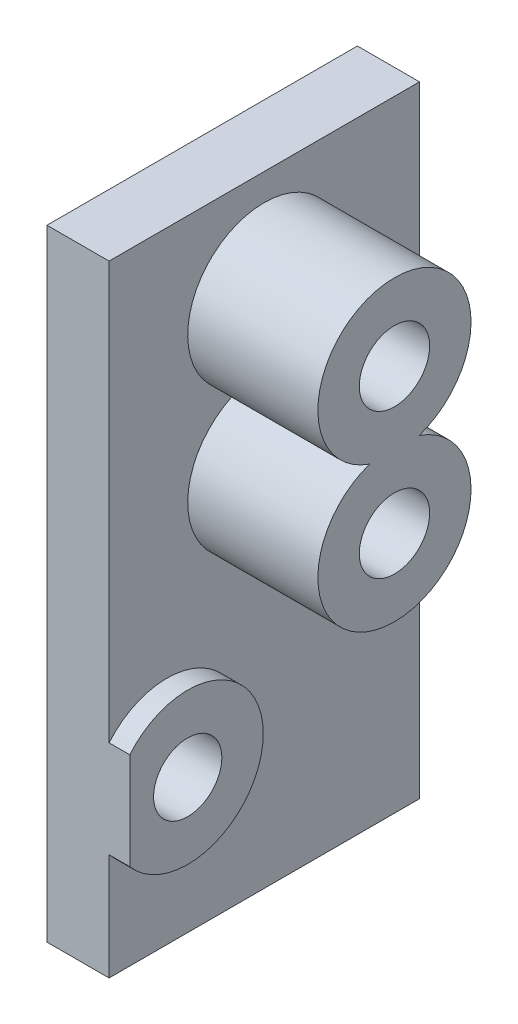
ISO-10303-21;
HEADER;
FILE_DESCRIPTION(('STEP AP214'),'2;1');
FILE_NAME('part.step','',(''),(''),'','','');
FILE_SCHEMA(('AUTOMOTIVE_DESIGN { 1 0 10303 214 1 1 1 1 }'));
ENDSEC;
DATA;
#1=APPLICATION_CONTEXT('core data for automotive mechanical design processes');
#2=APPLICATION_PROTOCOL_DEFINITION('international standard','automotive_design',2000,#1);
#3=PRODUCT_CONTEXT('',#1,'mechanical');
#4=PRODUCT('Part','Part','',(#3));
#5=PRODUCT_RELATED_PRODUCT_CATEGORY('part','',(#4));
#6=PRODUCT_DEFINITION_FORMATION('','',#4);
#7=PRODUCT_DEFINITION_CONTEXT('part definition',#1,'design');
#8=PRODUCT_DEFINITION('design','',#6,#7);
#9=PRODUCT_DEFINITION_SHAPE('','',#8);
#10=(LENGTH_UNIT() NAMED_UNIT(*) SI_UNIT(.MILLI.,.METRE.));
#11=(NAMED_UNIT(*) PLANE_ANGLE_UNIT() SI_UNIT($,.RADIAN.));
#12=(NAMED_UNIT(*) SI_UNIT($,.STERADIAN.) SOLID_ANGLE_UNIT());
#13=UNCERTAINTY_MEASURE_WITH_UNIT(LENGTH_MEASURE(1.E-05),#10,'distance_accuracy_value','');
#14=(GEOMETRIC_REPRESENTATION_CONTEXT(3) GLOBAL_UNCERTAINTY_ASSIGNED_CONTEXT((#13)) GLOBAL_UNIT_ASSIGNED_CONTEXT((#10,
#11,#12)) REPRESENTATION_CONTEXT('',''));
#15=CARTESIAN_POINT('',(0.,0.,0.));
#16=DIRECTION('',(0.,0.,1.));
#17=DIRECTION('',(1.,0.,0.));
#18=AXIS2_PLACEMENT_3D('',#15,#16,#17);
#19=CARTESIAN_POINT('',(-5.,0.,0.));
#20=DIRECTION('',(-1.,0.,0.));
#21=DIRECTION('',(0.,0.,-1.));
#22=AXIS2_PLACEMENT_3D('',#19,#20,#21);
#23=PLANE('',#22);
#24=CARTESIAN_POINT('',(-5.,7.5,-2.8));
#25=DIRECTION('',(-1.,0.,0.));
#26=DIRECTION('',(0.,0.,1.));
#27=AXIS2_PLACEMENT_3D('',#24,#25,#26);
#28=CIRCLE('',#27,3.65);
#29=CARTESIAN_POINT('',(-5.,9.84147389479362,0.));
#30=VERTEX_POINT('',#29);
#31=CARTESIAN_POINT('',(-5.,5.15852610520638,0.));
#32=VERTEX_POINT('',#31);
#33=EDGE_CURVE('E93',#30,#32,#28,.T.);
#34=ORIENTED_EDGE('',*,*,#33,.T.);
#35=DIRECTION('',(0.,1.,0.));
#36=VECTOR('',#35,1.);
#37=CARTESIAN_POINT('',(-5.,0.,0.));
#38=LINE('',#37,#36);
#39=CARTESIAN_POINT('',(-5.,0.,0.));
#40=VERTEX_POINT('',#39);
#41=EDGE_CURVE('E182',#40,#32,#38,.T.);
#42=ORIENTED_EDGE('',*,*,#41,.F.);
#43=DIRECTION('',(0.,0.,-1.));
#44=VECTOR('',#43,1.);
#45=CARTESIAN_POINT('',(-5.,0.,0.));
#46=LINE('',#45,#44);
#47=CARTESIAN_POINT('',(-5.,0.,-15.));
#48=VERTEX_POINT('',#47);
#49=EDGE_CURVE('E185',#40,#48,#46,.T.);
#50=ORIENTED_EDGE('',*,*,#49,.T.);
#51=DIRECTION('',(0.,1.,0.));
#52=VECTOR('',#51,1.);
#53=CARTESIAN_POINT('',(-5.,0.,-15.));
#54=LINE('',#53,#52);
#55=CARTESIAN_POINT('',(-5.,30.,-15.));
#56=VERTEX_POINT('',#55);
#57=EDGE_CURVE('E187',#48,#56,#54,.T.);
#58=ORIENTED_EDGE('',*,*,#57,.T.);
#59=DIRECTION('',(0.,0.,-1.));
#60=VECTOR('',#59,1.);
#61=CARTESIAN_POINT('',(-5.,30.,0.));
#62=LINE('',#61,#60);
#63=CARTESIAN_POINT('',(-5.,30.,0.));
#64=VERTEX_POINT('',#63);
#65=EDGE_CURVE('E178',#64,#56,#62,.T.);
#66=ORIENTED_EDGE('',*,*,#65,.F.);
#67=EDGE_CURVE('E181',#30,#64,#38,.T.);
#68=ORIENTED_EDGE('',*,*,#67,.F.);
#69=EDGE_LOOP('',(#34,#42,#50,#58,#66,#68));
#70=FACE_BOUND('',#69,.T.);
#71=CARTESIAN_POINT('',(-5.,18.,-7.5));
#72=DIRECTION('',(1.,0.,0.));
#73=DIRECTION('',(0.,0.,-1.));
#74=AXIS2_PLACEMENT_3D('',#71,#72,#73);
#75=CIRCLE('',#74,3.7);
#76=CARTESIAN_POINT('',(-5.,21.5,-6.30000000000001));
#77=VERTEX_POINT('',#76);
#78=CARTESIAN_POINT('',(-5.,21.5,-8.69999999999999));
#79=VERTEX_POINT('',#78);
#80=EDGE_CURVE('E146',#77,#79,#75,.T.);
#81=ORIENTED_EDGE('',*,*,#80,.F.);
#82=CARTESIAN_POINT('',(-5.,25.,-7.5));
#83=DIRECTION('',(1.,0.,0.));
#84=DIRECTION('',(0.,0.,-1.));
#85=AXIS2_PLACEMENT_3D('',#82,#83,#84);
#86=CIRCLE('',#85,3.7);
#87=EDGE_CURVE('E85',#79,#77,#86,.T.);
#88=ORIENTED_EDGE('',*,*,#87,.F.);
#89=EDGE_LOOP('',(#81,#88));
#90=FACE_BOUND('',#89,.T.);
#91=ADVANCED_FACE('F69',(#70,#90),#23,.F.);
#92=CARTESIAN_POINT('',(-6.,0.,0.));
#93=DIRECTION('',(0.,0.,-1.));
#94=DIRECTION('',(1.,0.,0.));
#95=AXIS2_PLACEMENT_3D('',#92,#93,#94);
#96=PLANE('',#95);
#97=DIRECTION('',(0.,1.,0.));
#98=VECTOR('',#97,1.);
#99=CARTESIAN_POINT('',(-8.,0.,0.));
#100=LINE('',#99,#98);
#101=CARTESIAN_POINT('',(-8.,0.,0.));
#102=VERTEX_POINT('',#101);
#103=CARTESIAN_POINT('',(-8.,30.,0.));
#104=VERTEX_POINT('',#103);
#105=EDGE_CURVE('E192',#102,#104,#100,.T.);
#106=ORIENTED_EDGE('',*,*,#105,.F.);
#107=DIRECTION('',(-1.,0.,0.));
#108=VECTOR('',#107,1.);
#109=CARTESIAN_POINT('',(-6.,0.,0.));
#110=LINE('',#109,#108);
#111=EDGE_CURVE('E73',#40,#102,#110,.T.);
#112=ORIENTED_EDGE('',*,*,#111,.F.);
#113=ORIENTED_EDGE('',*,*,#41,.T.);
#114=DIRECTION('',(-1.,0.,0.));
#115=VECTOR('',#114,1.);
#116=CARTESIAN_POINT('',(-4.,5.15852610520638,0.));
#117=LINE('',#116,#115);
#118=CARTESIAN_POINT('',(-4.,5.15852610520638,0.));
#119=VERTEX_POINT('',#118);
#120=EDGE_CURVE('E172',#119,#32,#117,.T.);
#121=ORIENTED_EDGE('',*,*,#120,.F.);
#122=DIRECTION('',(0.,1.,0.));
#123=VECTOR('',#122,1.);
#124=CARTESIAN_POINT('',(-4.,0.,0.));
#125=LINE('',#124,#123);
#126=CARTESIAN_POINT('',(-4.,9.84147389479362,0.));
#127=VERTEX_POINT('',#126);
#128=EDGE_CURVE('E167',#119,#127,#125,.T.);
#129=ORIENTED_EDGE('',*,*,#128,.T.);
#130=DIRECTION('',(-1.,0.,0.));
#131=VECTOR('',#130,1.);
#132=CARTESIAN_POINT('',(-4.,9.84147389479362,0.));
#133=LINE('',#132,#131);
#134=EDGE_CURVE('E175',#127,#30,#133,.T.);
#135=ORIENTED_EDGE('',*,*,#134,.T.);
#136=ORIENTED_EDGE('',*,*,#67,.T.);
#137=DIRECTION('',(-1.,0.,0.));
#138=VECTOR('',#137,1.);
#139=CARTESIAN_POINT('',(-6.,30.,0.));
#140=LINE('',#139,#138);
#141=EDGE_CURVE('E12',#64,#104,#140,.T.);
#142=ORIENTED_EDGE('',*,*,#141,.T.);
#143=EDGE_LOOP('',(#106,#112,#113,#121,#129,#135,#136,#142));
#144=FACE_BOUND('',#143,.T.);
#145=ADVANCED_FACE('F222',(#144),#96,.F.);
#146=CARTESIAN_POINT('',(-6.,30.,0.));
#147=DIRECTION('',(0.,-1.,0.));
#148=DIRECTION('',(0.,0.,-1.));
#149=AXIS2_PLACEMENT_3D('',#146,#147,#148);
#150=PLANE('',#149);
#151=DIRECTION('',(0.,0.,-1.));
#152=VECTOR('',#151,1.);
#153=CARTESIAN_POINT('',(-8.,30.,0.));
#154=LINE('',#153,#152);
#155=CARTESIAN_POINT('',(-8.,30.,-15.));
#156=VERTEX_POINT('',#155);
#157=EDGE_CURVE('E199',#104,#156,#154,.T.);
#158=ORIENTED_EDGE('',*,*,#157,.F.);
#159=ORIENTED_EDGE('',*,*,#141,.F.);
#160=ORIENTED_EDGE('',*,*,#65,.T.);
#161=DIRECTION('',(-1.,0.,0.));
#162=VECTOR('',#161,1.);
#163=CARTESIAN_POINT('',(-6.,30.,-15.));
#164=LINE('',#163,#162);
#165=EDGE_CURVE('E78',#56,#156,#164,.T.);
#166=ORIENTED_EDGE('',*,*,#165,.T.);
#167=EDGE_LOOP('',(#158,#159,#160,#166));
#168=FACE_BOUND('',#167,.T.);
#169=ADVANCED_FACE('F231',(#168),#150,.F.);
#170=CARTESIAN_POINT('',(-6.,0.,-15.));
#171=DIRECTION('',(0.,0.,-1.));
#172=DIRECTION('',(1.,0.,0.));
#173=AXIS2_PLACEMENT_3D('',#170,#171,#172);
#174=PLANE('',#173);
#175=DIRECTION('',(0.,1.,0.));
#176=VECTOR('',#175,1.);
#177=CARTESIAN_POINT('',(-8.,0.,-15.));
#178=LINE('',#177,#176);
#179=CARTESIAN_POINT('',(-8.,0.,-15.));
#180=VERTEX_POINT('',#179);
#181=EDGE_CURVE('E197',#180,#156,#178,.T.);
#182=ORIENTED_EDGE('',*,*,#181,.T.);
#183=ORIENTED_EDGE('',*,*,#165,.F.);
#184=ORIENTED_EDGE('',*,*,#57,.F.);
#185=DIRECTION('',(-1.,0.,0.));
#186=VECTOR('',#185,1.);
#187=CARTESIAN_POINT('',(-6.,0.,-15.));
#188=LINE('',#187,#186);
#189=EDGE_CURVE('E209',#48,#180,#188,.T.);
#190=ORIENTED_EDGE('',*,*,#189,.T.);
#191=EDGE_LOOP('',(#182,#183,#184,#190));
#192=FACE_BOUND('',#191,.T.);
#193=ADVANCED_FACE('F229',(#192),#174,.T.);
#194=CARTESIAN_POINT('',(-6.,25.,-7.5));
#195=DIRECTION('',(-1.,0.,0.));
#196=DIRECTION('',(0.,0.,-1.));
#197=AXIS2_PLACEMENT_3D('',#194,#195,#196);
#198=CYLINDRICAL_SURFACE('',#197,1.7);
#199=CARTESIAN_POINT('',(-8.,25.,-7.5));
#200=DIRECTION('',(1.,0.,0.));
#201=DIRECTION('',(0.,0.,-1.));
#202=AXIS2_PLACEMENT_3D('',#199,#200,#201);
#203=CIRCLE('',#202,1.7);
#204=CARTESIAN_POINT('',(-8.,25.,-9.2));
#205=VERTEX_POINT('',#204);
#206=EDGE_CURVE('E202',#205,#205,#203,.T.);
#207=ORIENTED_EDGE('',*,*,#206,.F.);
#208=EDGE_LOOP('',(#207));
#209=FACE_BOUND('',#208,.T.);
#210=CARTESIAN_POINT('',(1.29,25.,-7.5));
#211=DIRECTION('',(1.,0.,0.));
#212=DIRECTION('',(0.,0.,-1.));
#213=AXIS2_PLACEMENT_3D('',#210,#211,#212);
#214=CIRCLE('',#213,1.7);
#215=CARTESIAN_POINT('',(1.29,25.,-9.2));
#216=VERTEX_POINT('',#215);
#217=EDGE_CURVE('E158',#216,#216,#214,.T.);
#218=ORIENTED_EDGE('',*,*,#217,.T.);
#219=EDGE_LOOP('',(#218));
#220=FACE_BOUND('',#219,.T.);
#221=ADVANCED_FACE('F261',(#209,#220),#198,.F.);
#222=CARTESIAN_POINT('',(-6.,0.,0.));
#223=DIRECTION('',(0.,-1.,0.));
#224=DIRECTION('',(0.,0.,-1.));
#225=AXIS2_PLACEMENT_3D('',#222,#223,#224);
#226=PLANE('',#225);
#227=DIRECTION('',(0.,0.,-1.));
#228=VECTOR('',#227,1.);
#229=CARTESIAN_POINT('',(-8.,0.,0.));
#230=LINE('',#229,#228);
#231=EDGE_CURVE('E195',#102,#180,#230,.T.);
#232=ORIENTED_EDGE('',*,*,#231,.T.);
#233=ORIENTED_EDGE('',*,*,#189,.F.);
#234=ORIENTED_EDGE('',*,*,#49,.F.);
#235=ORIENTED_EDGE('',*,*,#111,.T.);
#236=EDGE_LOOP('',(#232,#233,#234,#235));
#237=FACE_BOUND('',#236,.T.);
#238=ADVANCED_FACE('F219',(#237),#226,.T.);
#239=CARTESIAN_POINT('',(-6.,7.5,-2.8));
#240=DIRECTION('',(-1.,0.,0.));
#241=DIRECTION('',(0.,0.,-1.));
#242=AXIS2_PLACEMENT_3D('',#239,#240,#241);
#243=CYLINDRICAL_SURFACE('',#242,1.65);
#244=CARTESIAN_POINT('',(-8.,7.5,-2.8));
#245=DIRECTION('',(1.,0.,0.));
#246=DIRECTION('',(0.,0.,-1.));
#247=AXIS2_PLACEMENT_3D('',#244,#245,#246);
#248=CIRCLE('',#247,1.65);
#249=CARTESIAN_POINT('',(-8.,7.5,-4.45));
#250=VERTEX_POINT('',#249);
#251=EDGE_CURVE('E189',#250,#250,#248,.T.);
#252=ORIENTED_EDGE('',*,*,#251,.F.);
#253=EDGE_LOOP('',(#252));
#254=FACE_BOUND('',#253,.T.);
#255=CARTESIAN_POINT('',(-4.,7.5,-2.8));
#256=DIRECTION('',(-1.,0.,0.));
#257=DIRECTION('',(0.,0.,1.));
#258=AXIS2_PLACEMENT_3D('',#255,#256,#257);
#259=CIRCLE('',#258,1.65);
#260=CARTESIAN_POINT('',(-4.,7.5,-1.15));
#261=VERTEX_POINT('',#260);
#262=EDGE_CURVE('E164',#261,#261,#259,.F.);
#263=ORIENTED_EDGE('',*,*,#262,.T.);
#264=EDGE_LOOP('',(#263));
#265=FACE_BOUND('',#264,.T.);
#266=ADVANCED_FACE('F71',(#254,#265),#243,.F.);
#267=CARTESIAN_POINT('',(-6.,18.,-7.5));
#268=DIRECTION('',(-1.,0.,0.));
#269=DIRECTION('',(0.,0.,-1.));
#270=AXIS2_PLACEMENT_3D('',#267,#268,#269);
#271=CYLINDRICAL_SURFACE('',#270,1.7);
#272=CARTESIAN_POINT('',(-8.,18.,-7.5));
#273=DIRECTION('',(1.,0.,0.));
#274=DIRECTION('',(0.,0.,-1.));
#275=AXIS2_PLACEMENT_3D('',#272,#273,#274);
#276=CIRCLE('',#275,1.7);
#277=CARTESIAN_POINT('',(-8.,18.,-9.2));
#278=VERTEX_POINT('',#277);
#279=EDGE_CURVE('E205',#278,#278,#276,.T.);
#280=ORIENTED_EDGE('',*,*,#279,.F.);
#281=EDGE_LOOP('',(#280));
#282=FACE_BOUND('',#281,.T.);
#283=CARTESIAN_POINT('',(1.29,18.,-7.5));
#284=DIRECTION('',(1.,0.,0.));
#285=DIRECTION('',(0.,0.,-1.));
#286=AXIS2_PLACEMENT_3D('',#283,#284,#285);
#287=CIRCLE('',#286,1.7);
#288=CARTESIAN_POINT('',(1.29,18.,-9.2));
#289=VERTEX_POINT('',#288);
#290=EDGE_CURVE('E154',#289,#289,#287,.T.);
#291=ORIENTED_EDGE('',*,*,#290,.T.);
#292=EDGE_LOOP('',(#291));
#293=FACE_BOUND('',#292,.T.);
#294=ADVANCED_FACE('F256',(#282,#293),#271,.F.);
#295=CARTESIAN_POINT('',(-8.,0.,0.));
#296=DIRECTION('',(-1.,0.,0.));
#297=DIRECTION('',(0.,0.,-1.));
#298=AXIS2_PLACEMENT_3D('',#295,#296,#297);
#299=PLANE('',#298);
#300=ORIENTED_EDGE('',*,*,#251,.T.);
#301=EDGE_LOOP('',(#300));
#302=FACE_BOUND('',#301,.T.);
#303=ORIENTED_EDGE('',*,*,#105,.T.);
#304=ORIENTED_EDGE('',*,*,#157,.T.);
#305=ORIENTED_EDGE('',*,*,#181,.F.);
#306=ORIENTED_EDGE('',*,*,#231,.F.);
#307=EDGE_LOOP('',(#303,#304,#305,#306));
#308=FACE_BOUND('',#307,.T.);
#309=ORIENTED_EDGE('',*,*,#206,.T.);
#310=EDGE_LOOP('',(#309));
#311=FACE_BOUND('',#310,.T.);
#312=ORIENTED_EDGE('',*,*,#279,.T.);
#313=EDGE_LOOP('',(#312));
#314=FACE_BOUND('',#313,.T.);
#315=ADVANCED_FACE('F226',(#302,#308,#311,#314),#299,.T.);
#316=CARTESIAN_POINT('',(-4.,7.5,-2.8));
#317=DIRECTION('',(-1.,0.,0.));
#318=DIRECTION('',(0.,0.,-1.));
#319=AXIS2_PLACEMENT_3D('',#316,#317,#318);
#320=CYLINDRICAL_SURFACE('',#319,3.65);
#321=ORIENTED_EDGE('',*,*,#33,.F.);
#322=ORIENTED_EDGE('',*,*,#134,.F.);
#323=CARTESIAN_POINT('',(-4.,7.5,-2.8));
#324=DIRECTION('',(-1.,0.,0.));
#325=DIRECTION('',(0.,0.,1.));
#326=AXIS2_PLACEMENT_3D('',#323,#324,#325);
#327=CIRCLE('',#326,3.65);
#328=EDGE_CURVE('E170',#127,#119,#327,.T.);
#329=ORIENTED_EDGE('',*,*,#328,.T.);
#330=ORIENTED_EDGE('',*,*,#120,.T.);
#331=EDGE_LOOP('',(#321,#322,#329,#330));
#332=FACE_BOUND('',#331,.T.);
#333=ADVANCED_FACE('F235',(#332),#320,.T.);
#334=CARTESIAN_POINT('',(-4.,0.,0.));
#335=DIRECTION('',(1.,0.,0.));
#336=DIRECTION('',(0.,0.,1.));
#337=AXIS2_PLACEMENT_3D('',#334,#335,#336);
#338=PLANE('',#337);
#339=ORIENTED_EDGE('',*,*,#262,.F.);
#340=EDGE_LOOP('',(#339));
#341=FACE_BOUND('',#340,.T.);
#342=ORIENTED_EDGE('',*,*,#128,.F.);
#343=ORIENTED_EDGE('',*,*,#328,.F.);
#344=EDGE_LOOP('',(#342,#343));
#345=FACE_BOUND('',#344,.T.);
#346=ADVANCED_FACE('F237',(#341,#345),#338,.T.);
#347=CARTESIAN_POINT('',(1.29,18.,-7.5));
#348=DIRECTION('',(-1.,0.,0.));
#349=DIRECTION('',(0.,0.,1.));
#350=AXIS2_PLACEMENT_3D('',#347,#348,#349);
#351=CYLINDRICAL_SURFACE('',#350,3.7);
#352=DIRECTION('',(-1.,0.,0.));
#353=VECTOR('',#352,1.);
#354=CARTESIAN_POINT('',(-1.855,21.5,-8.69999999999999));
#355=LINE('',#354,#353);
#356=CARTESIAN_POINT('',(1.29,21.5,-8.69999999999999));
#357=VERTEX_POINT('',#356);
#358=EDGE_CURVE('E142',#357,#79,#355,.T.);
#359=ORIENTED_EDGE('',*,*,#358,.F.);
#360=CARTESIAN_POINT('',(1.29,18.,-7.5));
#361=DIRECTION('',(1.,0.,0.));
#362=DIRECTION('',(0.,0.,-1.));
#363=AXIS2_PLACEMENT_3D('',#360,#361,#362);
#364=CIRCLE('',#363,3.7);
#365=CARTESIAN_POINT('',(1.29,21.5,-6.30000000000001));
#366=VERTEX_POINT('',#365);
#367=EDGE_CURVE('E137',#366,#357,#364,.T.);
#368=ORIENTED_EDGE('',*,*,#367,.F.);
#369=DIRECTION('',(-1.,0.,0.));
#370=VECTOR('',#369,1.);
#371=CARTESIAN_POINT('',(-1.855,21.5,-6.30000000000001));
#372=LINE('',#371,#370);
#373=EDGE_CURVE('E140',#77,#366,#372,.F.);
#374=ORIENTED_EDGE('',*,*,#373,.F.);
#375=ORIENTED_EDGE('',*,*,#80,.T.);
#376=EDGE_LOOP('',(#359,#368,#374,#375));
#377=FACE_BOUND('',#376,.T.);
#378=ADVANCED_FACE('F139',(#377),#351,.T.);
#379=CARTESIAN_POINT('',(1.29,18.,-7.5));
#380=DIRECTION('',(1.,0.,0.));
#381=DIRECTION('',(0.,0.,-1.));
#382=AXIS2_PLACEMENT_3D('',#379,#380,#381);
#383=PLANE('',#382);
#384=ORIENTED_EDGE('',*,*,#367,.T.);
#385=CARTESIAN_POINT('',(1.29,25.,-7.5));
#386=DIRECTION('',(1.,0.,0.));
#387=DIRECTION('',(0.,0.,-1.));
#388=AXIS2_PLACEMENT_3D('',#385,#386,#387);
#389=CIRCLE('',#388,3.7);
#390=EDGE_CURVE('E150',#357,#366,#389,.T.);
#391=ORIENTED_EDGE('',*,*,#390,.T.);
#392=EDGE_LOOP('',(#384,#391));
#393=FACE_BOUND('',#392,.T.);
#394=ORIENTED_EDGE('',*,*,#290,.F.);
#395=EDGE_LOOP('',(#394));
#396=FACE_BOUND('',#395,.T.);
#397=ORIENTED_EDGE('',*,*,#217,.F.);
#398=EDGE_LOOP('',(#397));
#399=FACE_BOUND('',#398,.T.);
#400=ADVANCED_FACE('F152',(#393,#396,#399),#383,.T.);
#401=CARTESIAN_POINT('',(1.29,25.,-7.5));
#402=DIRECTION('',(-1.,0.,0.));
#403=DIRECTION('',(0.,0.,1.));
#404=AXIS2_PLACEMENT_3D('',#401,#402,#403);
#405=CYLINDRICAL_SURFACE('',#404,3.7);
#406=ORIENTED_EDGE('',*,*,#390,.F.);
#407=ORIENTED_EDGE('',*,*,#358,.T.);
#408=ORIENTED_EDGE('',*,*,#87,.T.);
#409=ORIENTED_EDGE('',*,*,#373,.T.);
#410=EDGE_LOOP('',(#406,#407,#408,#409));
#411=FACE_BOUND('',#410,.T.);
#412=ADVANCED_FACE('F149',(#411),#405,.T.);
#413=CLOSED_SHELL('',(#91,#145,#169,#193,#221,#238,#266,#294,#315,#333,#346,#378,#400,#412));
#414=MANIFOLD_SOLID_BREP('B2',#413);
#415=ADVANCED_BREP_SHAPE_REPRESENTATION('',(#18,#414),#14);
#416=SHAPE_DEFINITION_REPRESENTATION(#9,#415);
ENDSEC;
END-ISO-10303-21;
